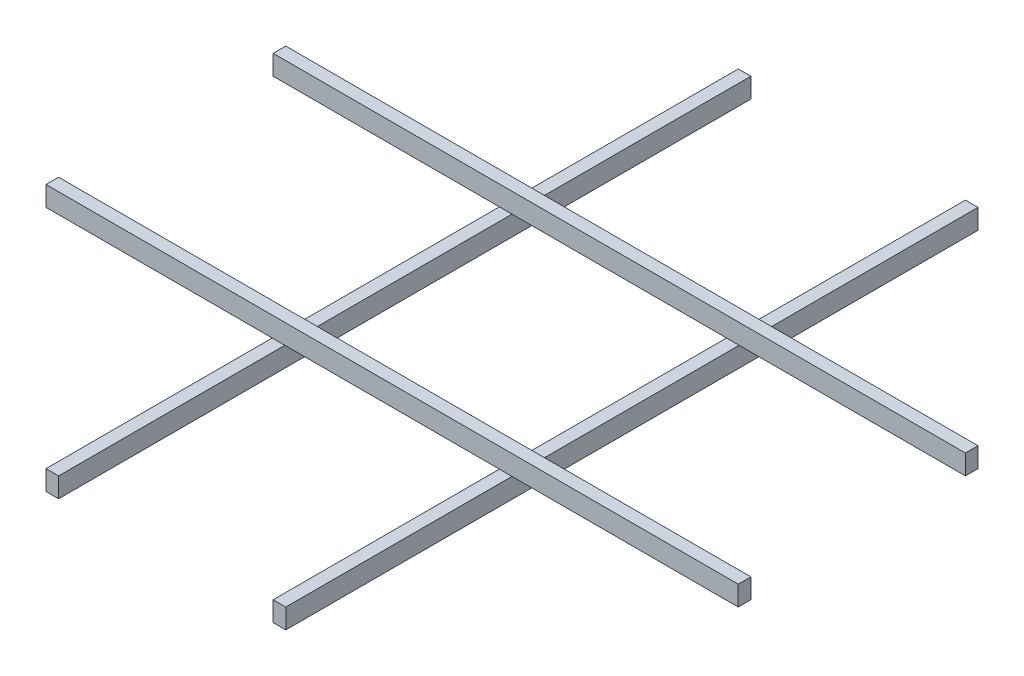
ISO-10303-21;
HEADER;
FILE_DESCRIPTION(('STEP AP214'),'2;1');
FILE_NAME('part.step','',(''),(''),'','','');
FILE_SCHEMA(('AUTOMOTIVE_DESIGN { 1 0 10303 214 1 1 1 1 }'));
ENDSEC;
DATA;
#1=APPLICATION_CONTEXT('core data for automotive mechanical design processes');
#2=APPLICATION_PROTOCOL_DEFINITION('international standard','automotive_design',2000,#1);
#3=PRODUCT_CONTEXT('',#1,'mechanical');
#4=PRODUCT('Part','Part','',(#3));
#5=PRODUCT_RELATED_PRODUCT_CATEGORY('part','',(#4));
#6=PRODUCT_DEFINITION_FORMATION('','',#4);
#7=PRODUCT_DEFINITION_CONTEXT('part definition',#1,'design');
#8=PRODUCT_DEFINITION('design','',#6,#7);
#9=PRODUCT_DEFINITION_SHAPE('','',#8);
#10=(LENGTH_UNIT() NAMED_UNIT(*) SI_UNIT(.MILLI.,.METRE.));
#11=(NAMED_UNIT(*) PLANE_ANGLE_UNIT() SI_UNIT($,.RADIAN.));
#12=(NAMED_UNIT(*) SI_UNIT($,.STERADIAN.) SOLID_ANGLE_UNIT());
#13=UNCERTAINTY_MEASURE_WITH_UNIT(LENGTH_MEASURE(1.E-05),#10,'distance_accuracy_value','');
#14=(GEOMETRIC_REPRESENTATION_CONTEXT(3) GLOBAL_UNCERTAINTY_ASSIGNED_CONTEXT((#13)) GLOBAL_UNIT_ASSIGNED_CONTEXT((#10,
#11,#12)) REPRESENTATION_CONTEXT('',''));
#15=CARTESIAN_POINT('',(0.,0.,0.));
#16=DIRECTION('',(0.,0.,1.));
#17=DIRECTION('',(1.,0.,0.));
#18=AXIS2_PLACEMENT_3D('',#15,#16,#17);
#19=CARTESIAN_POINT('',(4572.,209.55,-1682.75));
#20=DIRECTION('',(0.,0.,1.));
#21=DIRECTION('',(0.,-1.,0.));
#22=AXIS2_PLACEMENT_3D('',#19,#20,#21);
#23=PLANE('',#22);
#24=DIRECTION('',(0.,1.,0.));
#25=VECTOR('',#24,1.);
#26=CARTESIAN_POINT('',(-304.8,209.55,-1682.75));
#27=LINE('',#26,#25);
#28=CARTESIAN_POINT('',(-304.8,69.85,-1682.75));
#29=VERTEX_POINT('',#28);
#30=CARTESIAN_POINT('',(-304.8,209.55,-1682.75));
#31=VERTEX_POINT('',#30);
#32=EDGE_CURVE('E134',#29,#31,#27,.T.);
#33=ORIENTED_EDGE('',*,*,#32,.T.);
#34=DIRECTION('',(-1.,0.,0.));
#35=VECTOR('',#34,1.);
#36=CARTESIAN_POINT('',(4572.,209.55,-1682.75));
#37=LINE('',#36,#35);
#38=CARTESIAN_POINT('',(4572.,209.55,-1682.75));
#39=VERTEX_POINT('',#38);
#40=EDGE_CURVE('E13',#39,#31,#37,.T.);
#41=ORIENTED_EDGE('',*,*,#40,.F.);
#42=DIRECTION('',(0.,1.,0.));
#43=VECTOR('',#42,1.);
#44=CARTESIAN_POINT('',(4572.,209.55,-1682.75));
#45=LINE('',#44,#43);
#46=CARTESIAN_POINT('',(4572.,69.85,-1682.75));
#47=VERTEX_POINT('',#46);
#48=EDGE_CURVE('E121',#47,#39,#45,.T.);
#49=ORIENTED_EDGE('',*,*,#48,.F.);
#50=DIRECTION('',(-1.,0.,0.));
#51=VECTOR('',#50,1.);
#52=CARTESIAN_POINT('',(4572.,69.85,-1682.75));
#53=LINE('',#52,#51);
#54=EDGE_CURVE('E130',#47,#29,#53,.T.);
#55=ORIENTED_EDGE('',*,*,#54,.T.);
#56=EDGE_LOOP('',(#33,#41,#49,#55));
#57=FACE_BOUND('',#56,.T.);
#58=ADVANCED_FACE('F69',(#57),#23,.F.);
#59=CARTESIAN_POINT('',(4572.,209.55,-1593.85));
#60=DIRECTION('',(0.,-1.,0.));
#61=DIRECTION('',(0.,0.,-1.));
#62=AXIS2_PLACEMENT_3D('',#59,#60,#61);
#63=PLANE('',#62);
#64=DIRECTION('',(0.,0.,1.));
#65=VECTOR('',#64,1.);
#66=CARTESIAN_POINT('',(-304.8,209.55,-1593.85));
#67=LINE('',#66,#65);
#68=CARTESIAN_POINT('',(-304.8,209.55,-1593.85));
#69=VERTEX_POINT('',#68);
#70=EDGE_CURVE('E125',#31,#69,#67,.T.);
#71=ORIENTED_EDGE('',*,*,#70,.T.);
#72=DIRECTION('',(-1.,0.,0.));
#73=VECTOR('',#72,1.);
#74=CARTESIAN_POINT('',(4572.,209.55,-1593.85));
#75=LINE('',#74,#73);
#76=CARTESIAN_POINT('',(4572.,209.55,-1593.85));
#77=VERTEX_POINT('',#76);
#78=EDGE_CURVE('E78',#77,#69,#75,.T.);
#79=ORIENTED_EDGE('',*,*,#78,.F.);
#80=DIRECTION('',(0.,0.,1.));
#81=VECTOR('',#80,1.);
#82=CARTESIAN_POINT('',(4572.,209.55,-1593.85));
#83=LINE('',#82,#81);
#84=EDGE_CURVE('E116',#39,#77,#83,.T.);
#85=ORIENTED_EDGE('',*,*,#84,.F.);
#86=ORIENTED_EDGE('',*,*,#40,.T.);
#87=EDGE_LOOP('',(#71,#79,#85,#86));
#88=FACE_BOUND('',#87,.T.);
#89=ADVANCED_FACE('F124',(#88),#63,.F.);
#90=CARTESIAN_POINT('',(4572.,209.55,-1593.85));
#91=DIRECTION('',(0.,0.,-1.));
#92=DIRECTION('',(0.,1.,0.));
#93=AXIS2_PLACEMENT_3D('',#90,#91,#92);
#94=PLANE('',#93);
#95=DIRECTION('',(0.,-1.,0.));
#96=VECTOR('',#95,1.);
#97=CARTESIAN_POINT('',(-304.8,209.55,-1593.85));
#98=LINE('',#97,#96);
#99=CARTESIAN_POINT('',(-304.8,69.85,-1593.85));
#100=VERTEX_POINT('',#99);
#101=EDGE_CURVE('E103',#69,#100,#98,.T.);
#102=ORIENTED_EDGE('',*,*,#101,.T.);
#103=DIRECTION('',(-1.,0.,0.));
#104=VECTOR('',#103,1.);
#105=CARTESIAN_POINT('',(4572.,69.85,-1593.85));
#106=LINE('',#105,#104);
#107=CARTESIAN_POINT('',(4572.,69.85,-1593.85));
#108=VERTEX_POINT('',#107);
#109=EDGE_CURVE('E127',#108,#100,#106,.T.);
#110=ORIENTED_EDGE('',*,*,#109,.F.);
#111=DIRECTION('',(0.,-1.,0.));
#112=VECTOR('',#111,1.);
#113=CARTESIAN_POINT('',(4572.,209.55,-1593.85));
#114=LINE('',#113,#112);
#115=EDGE_CURVE('E119',#77,#108,#114,.T.);
#116=ORIENTED_EDGE('',*,*,#115,.F.);
#117=ORIENTED_EDGE('',*,*,#78,.T.);
#118=EDGE_LOOP('',(#102,#110,#116,#117));
#119=FACE_BOUND('',#118,.T.);
#120=ADVANCED_FACE('F128',(#119),#94,.F.);
#121=CARTESIAN_POINT('',(4572.,69.85,-1593.85));
#122=DIRECTION('',(0.,1.,0.));
#123=DIRECTION('',(0.,0.,1.));
#124=AXIS2_PLACEMENT_3D('',#121,#122,#123);
#125=PLANE('',#124);
#126=DIRECTION('',(0.,0.,-1.));
#127=VECTOR('',#126,1.);
#128=CARTESIAN_POINT('',(-304.8,69.85,-1593.85));
#129=LINE('',#128,#127);
#130=EDGE_CURVE('E109',#100,#29,#129,.T.);
#131=ORIENTED_EDGE('',*,*,#130,.T.);
#132=ORIENTED_EDGE('',*,*,#54,.F.);
#133=DIRECTION('',(0.,0.,-1.));
#134=VECTOR('',#133,1.);
#135=CARTESIAN_POINT('',(4572.,69.85,-1593.85));
#136=LINE('',#135,#134);
#137=EDGE_CURVE('E86',#108,#47,#136,.T.);
#138=ORIENTED_EDGE('',*,*,#137,.F.);
#139=ORIENTED_EDGE('',*,*,#109,.T.);
#140=EDGE_LOOP('',(#131,#132,#138,#139));
#141=FACE_BOUND('',#140,.T.);
#142=ADVANCED_FACE('F143',(#141),#125,.F.);
#143=CARTESIAN_POINT('',(4572.,139.7,-2971.8));
#144=DIRECTION('',(1.,0.,0.));
#145=DIRECTION('',(0.,0.,-1.));
#146=AXIS2_PLACEMENT_3D('',#143,#144,#145);
#147=PLANE('',#146);
#148=ORIENTED_EDGE('',*,*,#48,.T.);
#149=ORIENTED_EDGE('',*,*,#84,.T.);
#150=ORIENTED_EDGE('',*,*,#115,.T.);
#151=ORIENTED_EDGE('',*,*,#137,.T.);
#152=EDGE_LOOP('',(#148,#149,#150,#151));
#153=FACE_BOUND('',#152,.T.);
#154=ADVANCED_FACE('F117',(#153),#147,.T.);
#155=CARTESIAN_POINT('',(-304.8,139.7,-2971.8));
#156=DIRECTION('',(1.,0.,0.));
#157=DIRECTION('',(0.,0.,-1.));
#158=AXIS2_PLACEMENT_3D('',#155,#156,#157);
#159=PLANE('',#158);
#160=ORIENTED_EDGE('',*,*,#32,.F.);
#161=ORIENTED_EDGE('',*,*,#130,.F.);
#162=ORIENTED_EDGE('',*,*,#101,.F.);
#163=ORIENTED_EDGE('',*,*,#70,.F.);
#164=EDGE_LOOP('',(#160,#161,#162,#163));
#165=FACE_BOUND('',#164,.T.);
#166=ADVANCED_FACE('F146',(#165),#159,.F.);
#167=CLOSED_SHELL('',(#58,#89,#120,#142,#154,#166));
#168=MANIFOLD_SOLID_BREP('B2',#167);
#169=CARTESIAN_POINT('',(4572.,209.55,-3282.95));
#170=DIRECTION('',(0.,0.,1.));
#171=DIRECTION('',(0.,-1.,0.));
#172=AXIS2_PLACEMENT_3D('',#169,#170,#171);
#173=PLANE('',#172);
#174=DIRECTION('',(0.,1.,0.));
#175=VECTOR('',#174,1.);
#176=CARTESIAN_POINT('',(-304.8,209.55,-3282.95));
#177=LINE('',#176,#175);
#178=CARTESIAN_POINT('',(-304.8,69.85,-3282.95));
#179=VERTEX_POINT('',#178);
#180=CARTESIAN_POINT('',(-304.8,209.55,-3282.95));
#181=VERTEX_POINT('',#180);
#182=EDGE_CURVE('E297',#179,#181,#177,.T.);
#183=ORIENTED_EDGE('',*,*,#182,.T.);
#184=DIRECTION('',(-1.,0.,0.));
#185=VECTOR('',#184,1.);
#186=CARTESIAN_POINT('',(4572.,209.55,-3282.95));
#187=LINE('',#186,#185);
#188=CARTESIAN_POINT('',(4572.,209.55,-3282.95));
#189=VERTEX_POINT('',#188);
#190=EDGE_CURVE('E67',#189,#181,#187,.T.);
#191=ORIENTED_EDGE('',*,*,#190,.F.);
#192=DIRECTION('',(0.,1.,0.));
#193=VECTOR('',#192,1.);
#194=CARTESIAN_POINT('',(4572.,209.55,-3282.95));
#195=LINE('',#194,#193);
#196=CARTESIAN_POINT('',(4572.,69.85,-3282.95));
#197=VERTEX_POINT('',#196);
#198=EDGE_CURVE('E284',#197,#189,#195,.T.);
#199=ORIENTED_EDGE('',*,*,#198,.F.);
#200=DIRECTION('',(-1.,0.,0.));
#201=VECTOR('',#200,1.);
#202=CARTESIAN_POINT('',(4572.,69.85,-3282.95));
#203=LINE('',#202,#201);
#204=EDGE_CURVE('E293',#197,#179,#203,.T.);
#205=ORIENTED_EDGE('',*,*,#204,.T.);
#206=EDGE_LOOP('',(#183,#191,#199,#205));
#207=FACE_BOUND('',#206,.T.);
#208=ADVANCED_FACE('F232',(#207),#173,.F.);
#209=CARTESIAN_POINT('',(4572.,209.55,-3194.05));
#210=DIRECTION('',(0.,-1.,0.));
#211=DIRECTION('',(0.,0.,-1.));
#212=AXIS2_PLACEMENT_3D('',#209,#210,#211);
#213=PLANE('',#212);
#214=DIRECTION('',(0.,0.,1.));
#215=VECTOR('',#214,1.);
#216=CARTESIAN_POINT('',(-304.8,209.55,-3194.05));
#217=LINE('',#216,#215);
#218=CARTESIAN_POINT('',(-304.8,209.55,-3194.05));
#219=VERTEX_POINT('',#218);
#220=EDGE_CURVE('E288',#181,#219,#217,.T.);
#221=ORIENTED_EDGE('',*,*,#220,.T.);
#222=DIRECTION('',(-1.,0.,0.));
#223=VECTOR('',#222,1.);
#224=CARTESIAN_POINT('',(4572.,209.55,-3194.05));
#225=LINE('',#224,#223);
#226=CARTESIAN_POINT('',(4572.,209.55,-3194.05));
#227=VERTEX_POINT('',#226);
#228=EDGE_CURVE('E241',#227,#219,#225,.T.);
#229=ORIENTED_EDGE('',*,*,#228,.F.);
#230=DIRECTION('',(0.,0.,1.));
#231=VECTOR('',#230,1.);
#232=CARTESIAN_POINT('',(4572.,209.55,-3194.05));
#233=LINE('',#232,#231);
#234=EDGE_CURVE('E279',#189,#227,#233,.T.);
#235=ORIENTED_EDGE('',*,*,#234,.F.);
#236=ORIENTED_EDGE('',*,*,#190,.T.);
#237=EDGE_LOOP('',(#221,#229,#235,#236));
#238=FACE_BOUND('',#237,.T.);
#239=ADVANCED_FACE('F287',(#238),#213,.F.);
#240=CARTESIAN_POINT('',(4572.,209.55,-3194.05));
#241=DIRECTION('',(0.,0.,-1.));
#242=DIRECTION('',(0.,1.,0.));
#243=AXIS2_PLACEMENT_3D('',#240,#241,#242);
#244=PLANE('',#243);
#245=DIRECTION('',(0.,-1.,0.));
#246=VECTOR('',#245,1.);
#247=CARTESIAN_POINT('',(-304.8,209.55,-3194.05));
#248=LINE('',#247,#246);
#249=CARTESIAN_POINT('',(-304.8,69.85,-3194.05));
#250=VERTEX_POINT('',#249);
#251=EDGE_CURVE('E266',#219,#250,#248,.T.);
#252=ORIENTED_EDGE('',*,*,#251,.T.);
#253=DIRECTION('',(-1.,0.,0.));
#254=VECTOR('',#253,1.);
#255=CARTESIAN_POINT('',(4572.,69.85,-3194.05));
#256=LINE('',#255,#254);
#257=CARTESIAN_POINT('',(4572.,69.85,-3194.05));
#258=VERTEX_POINT('',#257);
#259=EDGE_CURVE('E290',#258,#250,#256,.T.);
#260=ORIENTED_EDGE('',*,*,#259,.F.);
#261=DIRECTION('',(0.,-1.,0.));
#262=VECTOR('',#261,1.);
#263=CARTESIAN_POINT('',(4572.,209.55,-3194.05));
#264=LINE('',#263,#262);
#265=EDGE_CURVE('E282',#227,#258,#264,.T.);
#266=ORIENTED_EDGE('',*,*,#265,.F.);
#267=ORIENTED_EDGE('',*,*,#228,.T.);
#268=EDGE_LOOP('',(#252,#260,#266,#267));
#269=FACE_BOUND('',#268,.T.);
#270=ADVANCED_FACE('F291',(#269),#244,.F.);
#271=CARTESIAN_POINT('',(4572.,69.85,-3194.05));
#272=DIRECTION('',(0.,1.,0.));
#273=DIRECTION('',(0.,0.,1.));
#274=AXIS2_PLACEMENT_3D('',#271,#272,#273);
#275=PLANE('',#274);
#276=DIRECTION('',(0.,0.,-1.));
#277=VECTOR('',#276,1.);
#278=CARTESIAN_POINT('',(-304.8,69.85,-3194.05));
#279=LINE('',#278,#277);
#280=EDGE_CURVE('E272',#250,#179,#279,.T.);
#281=ORIENTED_EDGE('',*,*,#280,.T.);
#282=ORIENTED_EDGE('',*,*,#204,.F.);
#283=DIRECTION('',(0.,0.,-1.));
#284=VECTOR('',#283,1.);
#285=CARTESIAN_POINT('',(4572.,69.85,-3194.05));
#286=LINE('',#285,#284);
#287=EDGE_CURVE('E249',#258,#197,#286,.T.);
#288=ORIENTED_EDGE('',*,*,#287,.F.);
#289=ORIENTED_EDGE('',*,*,#259,.T.);
#290=EDGE_LOOP('',(#281,#282,#288,#289));
#291=FACE_BOUND('',#290,.T.);
#292=ADVANCED_FACE('F306',(#291),#275,.F.);
#293=CARTESIAN_POINT('',(4572.,139.7,-4572.));
#294=DIRECTION('',(1.,0.,0.));
#295=DIRECTION('',(0.,0.,-1.));
#296=AXIS2_PLACEMENT_3D('',#293,#294,#295);
#297=PLANE('',#296);
#298=ORIENTED_EDGE('',*,*,#198,.T.);
#299=ORIENTED_EDGE('',*,*,#234,.T.);
#300=ORIENTED_EDGE('',*,*,#265,.T.);
#301=ORIENTED_EDGE('',*,*,#287,.T.);
#302=EDGE_LOOP('',(#298,#299,#300,#301));
#303=FACE_BOUND('',#302,.T.);
#304=ADVANCED_FACE('F280',(#303),#297,.T.);
#305=CARTESIAN_POINT('',(-304.8,139.7,-4572.));
#306=DIRECTION('',(1.,0.,0.));
#307=DIRECTION('',(0.,0.,-1.));
#308=AXIS2_PLACEMENT_3D('',#305,#306,#307);
#309=PLANE('',#308);
#310=ORIENTED_EDGE('',*,*,#182,.F.);
#311=ORIENTED_EDGE('',*,*,#280,.F.);
#312=ORIENTED_EDGE('',*,*,#251,.F.);
#313=ORIENTED_EDGE('',*,*,#220,.F.);
#314=EDGE_LOOP('',(#310,#311,#312,#313));
#315=FACE_BOUND('',#314,.T.);
#316=ADVANCED_FACE('F309',(#315),#309,.F.);
#317=CLOSED_SHELL('',(#208,#239,#270,#292,#304,#316));
#318=MANIFOLD_SOLID_BREP('B7',#317);
#319=CARTESIAN_POINT('',(2889.25,69.85,-4876.8));
#320=DIRECTION('',(1.,0.,0.));
#321=DIRECTION('',(0.,1.,0.));
#322=AXIS2_PLACEMENT_3D('',#319,#320,#321);
#323=PLANE('',#322);
#324=DIRECTION('',(0.,1.,0.));
#325=VECTOR('',#324,1.);
#326=CARTESIAN_POINT('',(2889.25,69.85,2.44959975999449E-13));
#327=LINE('',#326,#325);
#328=CARTESIAN_POINT('',(2889.25,-69.85,2.44959975999449E-13));
#329=VERTEX_POINT('',#328);
#330=CARTESIAN_POINT('',(2889.25,69.85,2.44959975999449E-13));
#331=VERTEX_POINT('',#330);
#332=EDGE_CURVE('E464',#329,#331,#327,.T.);
#333=ORIENTED_EDGE('',*,*,#332,.T.);
#334=DIRECTION('',(0.,0.,1.));
#335=VECTOR('',#334,1.);
#336=CARTESIAN_POINT('',(2889.25,69.85,-4876.8));
#337=LINE('',#336,#335);
#338=CARTESIAN_POINT('',(2889.25,69.85,-4876.8));
#339=VERTEX_POINT('',#338);
#340=EDGE_CURVE('E230',#339,#331,#337,.T.);
#341=ORIENTED_EDGE('',*,*,#340,.F.);
#342=DIRECTION('',(0.,1.,0.));
#343=VECTOR('',#342,1.);
#344=CARTESIAN_POINT('',(2889.25,69.85,-4876.8));
#345=LINE('',#344,#343);
#346=CARTESIAN_POINT('',(2889.25,-69.85,-4876.8));
#347=VERTEX_POINT('',#346);
#348=EDGE_CURVE('E449',#347,#339,#345,.T.);
#349=ORIENTED_EDGE('',*,*,#348,.F.);
#350=DIRECTION('',(0.,0.,1.));
#351=VECTOR('',#350,1.);
#352=CARTESIAN_POINT('',(2889.25,-69.85,-4876.8));
#353=LINE('',#352,#351);
#354=EDGE_CURVE('E460',#347,#329,#353,.T.);
#355=ORIENTED_EDGE('',*,*,#354,.T.);
#356=EDGE_LOOP('',(#333,#341,#349,#355));
#357=FACE_BOUND('',#356,.T.);
#358=ADVANCED_FACE('F396',(#357),#323,.F.);
#359=CARTESIAN_POINT('',(2978.15,69.85,-4876.8));
#360=DIRECTION('',(0.,-1.,0.));
#361=DIRECTION('',(0.,0.,-1.));
#362=AXIS2_PLACEMENT_3D('',#359,#360,#361);
#363=PLANE('',#362);
#364=DIRECTION('',(1.,0.,0.));
#365=VECTOR('',#364,1.);
#366=CARTESIAN_POINT('',(2978.15,69.85,2.44959975999449E-13));
#367=LINE('',#366,#365);
#368=CARTESIAN_POINT('',(2978.15,69.85,2.44959975999449E-13));
#369=VERTEX_POINT('',#368);
#370=EDGE_CURVE('E453',#331,#369,#367,.T.);
#371=ORIENTED_EDGE('',*,*,#370,.T.);
#372=DIRECTION('',(0.,0.,1.));
#373=VECTOR('',#372,1.);
#374=CARTESIAN_POINT('',(2978.15,69.85,-4876.8));
#375=LINE('',#374,#373);
#376=CARTESIAN_POINT('',(2978.15,69.85,-4876.8));
#377=VERTEX_POINT('',#376);
#378=EDGE_CURVE('E405',#377,#369,#375,.T.);
#379=ORIENTED_EDGE('',*,*,#378,.F.);
#380=DIRECTION('',(1.,0.,0.));
#381=VECTOR('',#380,1.);
#382=CARTESIAN_POINT('',(2978.15,69.85,-4876.8));
#383=LINE('',#382,#381);
#384=EDGE_CURVE('E444',#339,#377,#383,.T.);
#385=ORIENTED_EDGE('',*,*,#384,.F.);
#386=ORIENTED_EDGE('',*,*,#340,.T.);
#387=EDGE_LOOP('',(#371,#379,#385,#386));
#388=FACE_BOUND('',#387,.T.);
#389=ADVANCED_FACE('F452',(#388),#363,.F.);
#390=CARTESIAN_POINT('',(2978.15,69.85,-4876.8));
#391=DIRECTION('',(-1.,0.,0.));
#392=DIRECTION('',(0.,-1.,0.));
#393=AXIS2_PLACEMENT_3D('',#390,#391,#392);
#394=PLANE('',#393);
#395=DIRECTION('',(0.,-1.,0.));
#396=VECTOR('',#395,1.);
#397=CARTESIAN_POINT('',(2978.15,69.85,2.44959975999449E-13));
#398=LINE('',#397,#396);
#399=CARTESIAN_POINT('',(2978.15,-69.85,2.44959975999449E-13));
#400=VERTEX_POINT('',#399);
#401=EDGE_CURVE('E431',#369,#400,#398,.T.);
#402=ORIENTED_EDGE('',*,*,#401,.T.);
#403=DIRECTION('',(0.,0.,1.));
#404=VECTOR('',#403,1.);
#405=CARTESIAN_POINT('',(2978.15,-69.85,-4876.8));
#406=LINE('',#405,#404);
#407=CARTESIAN_POINT('',(2978.15,-69.85,-4876.8));
#408=VERTEX_POINT('',#407);
#409=EDGE_CURVE('E455',#408,#400,#406,.T.);
#410=ORIENTED_EDGE('',*,*,#409,.F.);
#411=DIRECTION('',(0.,-1.,0.));
#412=VECTOR('',#411,1.);
#413=CARTESIAN_POINT('',(2978.15,69.85,-4876.8));
#414=LINE('',#413,#412);
#415=EDGE_CURVE('E447',#377,#408,#414,.T.);
#416=ORIENTED_EDGE('',*,*,#415,.F.);
#417=ORIENTED_EDGE('',*,*,#378,.T.);
#418=EDGE_LOOP('',(#402,#410,#416,#417));
#419=FACE_BOUND('',#418,.T.);
#420=ADVANCED_FACE('F456',(#419),#394,.F.);
#421=CARTESIAN_POINT('',(2978.15,-69.85,-4876.8));
#422=DIRECTION('',(0.,1.,0.));
#423=DIRECTION('',(0.,0.,1.));
#424=AXIS2_PLACEMENT_3D('',#421,#422,#423);
#425=PLANE('',#424);
#426=DIRECTION('',(-1.,0.,0.));
#427=VECTOR('',#426,1.);
#428=CARTESIAN_POINT('',(2978.15,-69.85,2.44959975999449E-13));
#429=LINE('',#428,#427);
#430=EDGE_CURVE('E437',#400,#329,#429,.T.);
#431=ORIENTED_EDGE('',*,*,#430,.T.);
#432=ORIENTED_EDGE('',*,*,#354,.F.);
#433=DIRECTION('',(-1.,0.,0.));
#434=VECTOR('',#433,1.);
#435=CARTESIAN_POINT('',(2978.15,-69.85,-4876.8));
#436=LINE('',#435,#434);
#437=EDGE_CURVE('E413',#408,#347,#436,.T.);
#438=ORIENTED_EDGE('',*,*,#437,.F.);
#439=ORIENTED_EDGE('',*,*,#409,.T.);
#440=EDGE_LOOP('',(#431,#432,#438,#439));
#441=FACE_BOUND('',#440,.T.);
#442=ADVANCED_FACE('F473',(#441),#425,.F.);
#443=CARTESIAN_POINT('',(1600.2,0.,-4876.8));
#444=DIRECTION('',(0.,0.,-1.));
#445=DIRECTION('',(-1.,0.,0.));
#446=AXIS2_PLACEMENT_3D('',#443,#444,#445);
#447=PLANE('',#446);
#448=ORIENTED_EDGE('',*,*,#348,.T.);
#449=ORIENTED_EDGE('',*,*,#384,.T.);
#450=ORIENTED_EDGE('',*,*,#415,.T.);
#451=ORIENTED_EDGE('',*,*,#437,.T.);
#452=EDGE_LOOP('',(#448,#449,#450,#451));
#453=FACE_BOUND('',#452,.T.);
#454=ADVANCED_FACE('F445',(#453),#447,.T.);
#455=CARTESIAN_POINT('',(1600.2,0.,2.44959975999449E-13));
#456=DIRECTION('',(0.,0.,-1.));
#457=DIRECTION('',(-1.,0.,0.));
#458=AXIS2_PLACEMENT_3D('',#455,#456,#457);
#459=PLANE('',#458);
#460=ORIENTED_EDGE('',*,*,#332,.F.);
#461=ORIENTED_EDGE('',*,*,#430,.F.);
#462=ORIENTED_EDGE('',*,*,#401,.F.);
#463=ORIENTED_EDGE('',*,*,#370,.F.);
#464=EDGE_LOOP('',(#460,#461,#462,#463));
#465=FACE_BOUND('',#464,.T.);
#466=ADVANCED_FACE('F476',(#465),#459,.F.);
#467=CLOSED_SHELL('',(#358,#389,#420,#442,#454,#466));
#468=MANIFOLD_SOLID_BREP('B61',#467);
#469=CARTESIAN_POINT('',(1289.05,69.85,-4876.8));
#470=DIRECTION('',(1.,0.,0.));
#471=DIRECTION('',(0.,1.,0.));
#472=AXIS2_PLACEMENT_3D('',#469,#470,#471);
#473=PLANE('',#472);
#474=DIRECTION('',(0.,1.,0.));
#475=VECTOR('',#474,1.);
#476=CARTESIAN_POINT('',(1289.05,69.85,8.88178419700125E-13));
#477=LINE('',#476,#475);
#478=CARTESIAN_POINT('',(1289.05,-69.85,8.88178419700125E-13));
#479=VERTEX_POINT('',#478);
#480=CARTESIAN_POINT('',(1289.05,69.85,8.88178419700125E-13));
#481=VERTEX_POINT('',#480);
#482=EDGE_CURVE('E620',#479,#481,#477,.T.);
#483=ORIENTED_EDGE('',*,*,#482,.T.);
#484=DIRECTION('',(0.,0.,1.));
#485=VECTOR('',#484,1.);
#486=CARTESIAN_POINT('',(1289.05,69.85,-4876.8));
#487=LINE('',#486,#485);
#488=CARTESIAN_POINT('',(1289.05,69.85,-4876.8));
#489=VERTEX_POINT('',#488);
#490=EDGE_CURVE('E394',#489,#481,#487,.T.);
#491=ORIENTED_EDGE('',*,*,#490,.F.);
#492=DIRECTION('',(0.,1.,0.));
#493=VECTOR('',#492,1.);
#494=CARTESIAN_POINT('',(1289.05,69.85,-4876.8));
#495=LINE('',#494,#493);
#496=CARTESIAN_POINT('',(1289.05,-69.85,-4876.8));
#497=VERTEX_POINT('',#496);
#498=EDGE_CURVE('E607',#497,#489,#495,.T.);
#499=ORIENTED_EDGE('',*,*,#498,.F.);
#500=DIRECTION('',(0.,0.,1.));
#501=VECTOR('',#500,1.);
#502=CARTESIAN_POINT('',(1289.05,-69.85,-4876.8));
#503=LINE('',#502,#501);
#504=EDGE_CURVE('E616',#497,#479,#503,.T.);
#505=ORIENTED_EDGE('',*,*,#504,.T.);
#506=EDGE_LOOP('',(#483,#491,#499,#505));
#507=FACE_BOUND('',#506,.T.);
#508=ADVANCED_FACE('F555',(#507),#473,.F.);
#509=CARTESIAN_POINT('',(1377.95,69.85,-4876.8));
#510=DIRECTION('',(0.,-1.,0.));
#511=DIRECTION('',(0.,0.,-1.));
#512=AXIS2_PLACEMENT_3D('',#509,#510,#511);
#513=PLANE('',#512);
#514=DIRECTION('',(1.,0.,0.));
#515=VECTOR('',#514,1.);
#516=CARTESIAN_POINT('',(1377.95,69.85,8.88178419700125E-13));
#517=LINE('',#516,#515);
#518=CARTESIAN_POINT('',(1377.95,69.85,8.88178419700125E-13));
#519=VERTEX_POINT('',#518);
#520=EDGE_CURVE('E611',#481,#519,#517,.T.);
#521=ORIENTED_EDGE('',*,*,#520,.T.);
#522=DIRECTION('',(0.,0.,1.));
#523=VECTOR('',#522,1.);
#524=CARTESIAN_POINT('',(1377.95,69.85,-4876.8));
#525=LINE('',#524,#523);
#526=CARTESIAN_POINT('',(1377.95,69.85,-4876.8));
#527=VERTEX_POINT('',#526);
#528=EDGE_CURVE('E564',#527,#519,#525,.T.);
#529=ORIENTED_EDGE('',*,*,#528,.F.);
#530=DIRECTION('',(1.,0.,0.));
#531=VECTOR('',#530,1.);
#532=CARTESIAN_POINT('',(1377.95,69.85,-4876.8));
#533=LINE('',#532,#531);
#534=EDGE_CURVE('E602',#489,#527,#533,.T.);
#535=ORIENTED_EDGE('',*,*,#534,.F.);
#536=ORIENTED_EDGE('',*,*,#490,.T.);
#537=EDGE_LOOP('',(#521,#529,#535,#536));
#538=FACE_BOUND('',#537,.T.);
#539=ADVANCED_FACE('F610',(#538),#513,.F.);
#540=CARTESIAN_POINT('',(1377.95,69.85,-4876.8));
#541=DIRECTION('',(-1.,0.,0.));
#542=DIRECTION('',(0.,-1.,0.));
#543=AXIS2_PLACEMENT_3D('',#540,#541,#542);
#544=PLANE('',#543);
#545=DIRECTION('',(0.,-1.,0.));
#546=VECTOR('',#545,1.);
#547=CARTESIAN_POINT('',(1377.95,69.85,8.88178419700125E-13));
#548=LINE('',#547,#546);
#549=CARTESIAN_POINT('',(1377.95,-69.85,8.88178419700125E-13));
#550=VERTEX_POINT('',#549);
#551=EDGE_CURVE('E589',#519,#550,#548,.T.);
#552=ORIENTED_EDGE('',*,*,#551,.T.);
#553=DIRECTION('',(0.,0.,1.));
#554=VECTOR('',#553,1.);
#555=CARTESIAN_POINT('',(1377.95,-69.85,-4876.8));
#556=LINE('',#555,#554);
#557=CARTESIAN_POINT('',(1377.95,-69.85,-4876.8));
#558=VERTEX_POINT('',#557);
#559=EDGE_CURVE('E613',#558,#550,#556,.T.);
#560=ORIENTED_EDGE('',*,*,#559,.F.);
#561=DIRECTION('',(0.,-1.,0.));
#562=VECTOR('',#561,1.);
#563=CARTESIAN_POINT('',(1377.95,69.85,-4876.8));
#564=LINE('',#563,#562);
#565=EDGE_CURVE('E605',#527,#558,#564,.T.);
#566=ORIENTED_EDGE('',*,*,#565,.F.);
#567=ORIENTED_EDGE('',*,*,#528,.T.);
#568=EDGE_LOOP('',(#552,#560,#566,#567));
#569=FACE_BOUND('',#568,.T.);
#570=ADVANCED_FACE('F614',(#569),#544,.F.);
#571=CARTESIAN_POINT('',(1377.95,-69.85,-4876.8));
#572=DIRECTION('',(0.,1.,0.));
#573=DIRECTION('',(0.,0.,1.));
#574=AXIS2_PLACEMENT_3D('',#571,#572,#573);
#575=PLANE('',#574);
#576=DIRECTION('',(-1.,0.,0.));
#577=VECTOR('',#576,1.);
#578=CARTESIAN_POINT('',(1377.95,-69.85,8.88178419700125E-13));
#579=LINE('',#578,#577);
#580=EDGE_CURVE('E595',#550,#479,#579,.T.);
#581=ORIENTED_EDGE('',*,*,#580,.T.);
#582=ORIENTED_EDGE('',*,*,#504,.F.);
#583=DIRECTION('',(-1.,0.,0.));
#584=VECTOR('',#583,1.);
#585=CARTESIAN_POINT('',(1377.95,-69.85,-4876.8));
#586=LINE('',#585,#584);
#587=EDGE_CURVE('E572',#558,#497,#586,.T.);
#588=ORIENTED_EDGE('',*,*,#587,.F.);
#589=ORIENTED_EDGE('',*,*,#559,.T.);
#590=EDGE_LOOP('',(#581,#582,#588,#589));
#591=FACE_BOUND('',#590,.T.);
#592=ADVANCED_FACE('F629',(#591),#575,.F.);
#593=CARTESIAN_POINT('',(0.,0.,-4876.8));
#594=DIRECTION('',(0.,0.,-1.));
#595=DIRECTION('',(-1.,0.,0.));
#596=AXIS2_PLACEMENT_3D('',#593,#594,#595);
#597=PLANE('',#596);
#598=ORIENTED_EDGE('',*,*,#498,.T.);
#599=ORIENTED_EDGE('',*,*,#534,.T.);
#600=ORIENTED_EDGE('',*,*,#565,.T.);
#601=ORIENTED_EDGE('',*,*,#587,.T.);
#602=EDGE_LOOP('',(#598,#599,#600,#601));
#603=FACE_BOUND('',#602,.T.);
#604=ADVANCED_FACE('F603',(#603),#597,.T.);
#605=CARTESIAN_POINT('',(0.,0.,8.88178419700125E-13));
#606=DIRECTION('',(0.,0.,-1.));
#607=DIRECTION('',(-1.,0.,0.));
#608=AXIS2_PLACEMENT_3D('',#605,#606,#607);
#609=PLANE('',#608);
#610=ORIENTED_EDGE('',*,*,#482,.F.);
#611=ORIENTED_EDGE('',*,*,#580,.F.);
#612=ORIENTED_EDGE('',*,*,#551,.F.);
#613=ORIENTED_EDGE('',*,*,#520,.F.);
#614=EDGE_LOOP('',(#610,#611,#612,#613));
#615=FACE_BOUND('',#614,.T.);
#616=ADVANCED_FACE('F632',(#615),#609,.F.);
#617=CLOSED_SHELL('',(#508,#539,#570,#592,#604,#616));
#618=MANIFOLD_SOLID_BREP('B224',#617);
#619=ADVANCED_BREP_SHAPE_REPRESENTATION('',(#18,#168,#318,#468,#618),#14);
#620=SHAPE_DEFINITION_REPRESENTATION(#9,#619);
ENDSEC;
END-ISO-10303-21;
